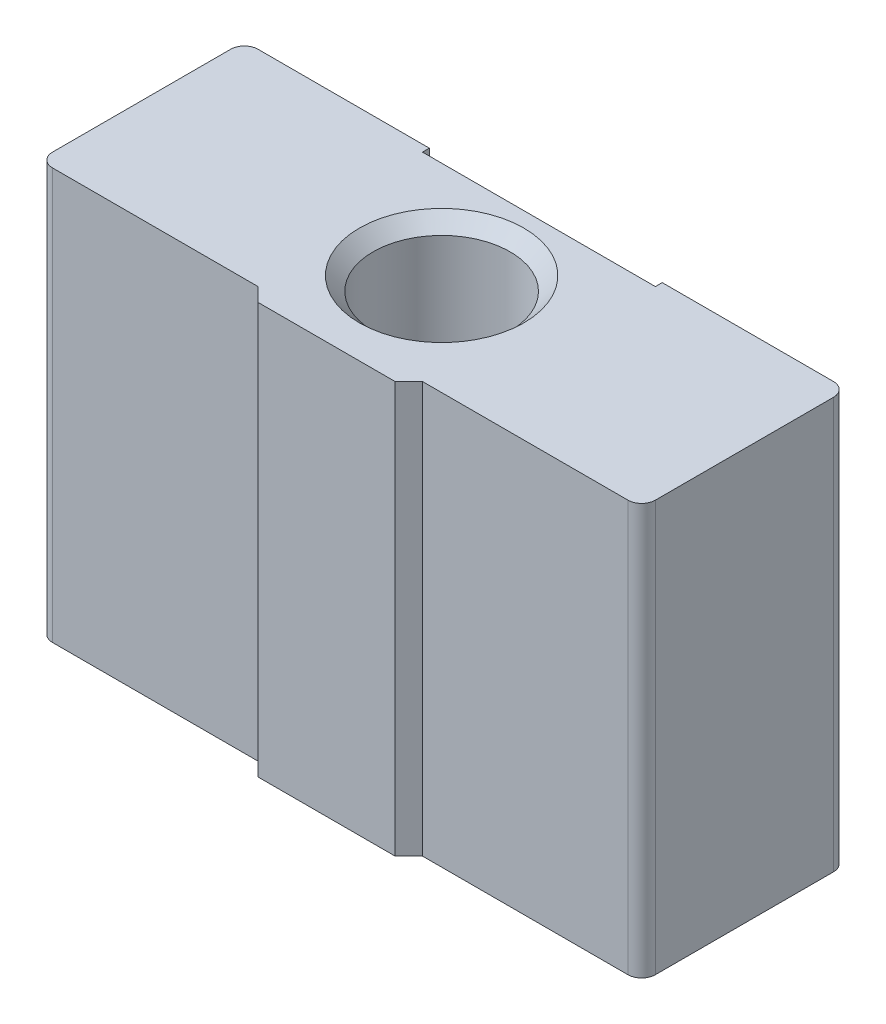
ISO-10303-21;
HEADER;
FILE_DESCRIPTION(('STEP AP214'),'2;1');
FILE_NAME('part.step','',(''),(''),'','','');
FILE_SCHEMA(('AUTOMOTIVE_DESIGN { 1 0 10303 214 1 1 1 1 }'));
ENDSEC;
DATA;
#1=APPLICATION_CONTEXT('core data for automotive mechanical design processes');
#2=APPLICATION_PROTOCOL_DEFINITION('international standard','automotive_design',2000,#1);
#3=PRODUCT_CONTEXT('',#1,'mechanical');
#4=PRODUCT('Part','Part','',(#3));
#5=PRODUCT_RELATED_PRODUCT_CATEGORY('part','',(#4));
#6=PRODUCT_DEFINITION_FORMATION('','',#4);
#7=PRODUCT_DEFINITION_CONTEXT('part definition',#1,'design');
#8=PRODUCT_DEFINITION('design','',#6,#7);
#9=PRODUCT_DEFINITION_SHAPE('','',#8);
#10=(LENGTH_UNIT() NAMED_UNIT(*) SI_UNIT(.MILLI.,.METRE.));
#11=(NAMED_UNIT(*) PLANE_ANGLE_UNIT() SI_UNIT($,.RADIAN.));
#12=(NAMED_UNIT(*) SI_UNIT($,.STERADIAN.) SOLID_ANGLE_UNIT());
#13=UNCERTAINTY_MEASURE_WITH_UNIT(LENGTH_MEASURE(1.E-05),#10,'distance_accuracy_value','');
#14=(GEOMETRIC_REPRESENTATION_CONTEXT(3) GLOBAL_UNCERTAINTY_ASSIGNED_CONTEXT((#13)) GLOBAL_UNIT_ASSIGNED_CONTEXT((#10,
#11,#12)) REPRESENTATION_CONTEXT('',''));
#15=CARTESIAN_POINT('',(0.,0.,0.));
#16=DIRECTION('',(0.,0.,1.));
#17=DIRECTION('',(1.,0.,0.));
#18=AXIS2_PLACEMENT_3D('',#15,#16,#17);
#19=CARTESIAN_POINT('',(-22.,30.,0.));
#20=DIRECTION('',(0.,0.,1.));
#21=DIRECTION('',(1.,0.,0.));
#22=AXIS2_PLACEMENT_3D('',#19,#20,#21);
#23=PLANE('',#22);
#24=CARTESIAN_POINT('',(16.,6.,0.));
#25=DIRECTION('',(0.,0.,-1.));
#26=DIRECTION('',(-1.,0.,0.));
#27=AXIS2_PLACEMENT_3D('',#24,#25,#26);
#28=CIRCLE('',#27,2.25);
#29=CARTESIAN_POINT('',(13.75,6.,0.));
#30=VERTEX_POINT('',#29);
#31=EDGE_CURVE('E219',#30,#30,#28,.T.);
#32=ORIENTED_EDGE('',*,*,#31,.F.);
#33=EDGE_LOOP('',(#32));
#34=FACE_BOUND('',#33,.T.);
#35=CARTESIAN_POINT('',(16.,24.,0.));
#36=DIRECTION('',(0.,0.,-1.));
#37=DIRECTION('',(-1.,0.,0.));
#38=AXIS2_PLACEMENT_3D('',#35,#36,#37);
#39=CIRCLE('',#38,2.25);
#40=CARTESIAN_POINT('',(13.75,24.,0.));
#41=VERTEX_POINT('',#40);
#42=EDGE_CURVE('E197',#41,#41,#39,.T.);
#43=ORIENTED_EDGE('',*,*,#42,.F.);
#44=EDGE_LOOP('',(#43));
#45=FACE_BOUND('',#44,.T.);
#46=DIRECTION('',(-1.,0.,0.));
#47=VECTOR('',#46,1.);
#48=CARTESIAN_POINT('',(-22.,30.,0.));
#49=LINE('',#48,#47);
#50=CARTESIAN_POINT('',(21.,30.,0.));
#51=VERTEX_POINT('',#50);
#52=CARTESIAN_POINT('',(8.5,30.,0.));
#53=VERTEX_POINT('',#52);
#54=EDGE_CURVE('E186',#51,#53,#49,.T.);
#55=ORIENTED_EDGE('',*,*,#54,.F.);
#56=DIRECTION('',(0.,-1.,0.));
#57=VECTOR('',#56,1.);
#58=CARTESIAN_POINT('',(21.,30.,0.));
#59=LINE('',#58,#57);
#60=CARTESIAN_POINT('',(21.,0.,0.));
#61=VERTEX_POINT('',#60);
#62=EDGE_CURVE('E312',#51,#61,#59,.T.);
#63=ORIENTED_EDGE('',*,*,#62,.T.);
#64=DIRECTION('',(-1.,0.,0.));
#65=VECTOR('',#64,1.);
#66=CARTESIAN_POINT('',(-22.,0.,0.));
#67=LINE('',#66,#65);
#68=CARTESIAN_POINT('',(8.5,0.,0.));
#69=VERTEX_POINT('',#68);
#70=EDGE_CURVE('E251',#61,#69,#67,.T.);
#71=ORIENTED_EDGE('',*,*,#70,.T.);
#72=DIRECTION('',(0.,-1.,0.));
#73=VECTOR('',#72,1.);
#74=CARTESIAN_POINT('',(8.5,30.,0.));
#75=LINE('',#74,#73);
#76=EDGE_CURVE('E195',#53,#69,#75,.T.);
#77=ORIENTED_EDGE('',*,*,#76,.F.);
#78=EDGE_LOOP('',(#55,#63,#71,#77));
#79=FACE_BOUND('',#78,.T.);
#80=ADVANCED_FACE('F38',(#34,#45,#79),#23,.F.);
#81=CARTESIAN_POINT('',(-22.,30.,15.));
#82=DIRECTION('',(0.,0.,-1.));
#83=DIRECTION('',(-1.,0.,0.));
#84=AXIS2_PLACEMENT_3D('',#81,#82,#83);
#85=PLANE('',#84);
#86=DIRECTION('',(1.,0.,0.));
#87=VECTOR('',#86,1.);
#88=CARTESIAN_POINT('',(-22.,30.,15.));
#89=LINE('',#88,#87);
#90=CARTESIAN_POINT('',(-21.,30.,15.));
#91=VERTEX_POINT('',#90);
#92=CARTESIAN_POINT('',(-6.00000000000001,30.,15.));
#93=VERTEX_POINT('',#92);
#94=EDGE_CURVE('E226',#91,#93,#89,.T.);
#95=ORIENTED_EDGE('',*,*,#94,.F.);
#96=DIRECTION('',(0.,-1.,0.));
#97=VECTOR('',#96,1.);
#98=CARTESIAN_POINT('',(-21.,30.,15.));
#99=LINE('',#98,#97);
#100=CARTESIAN_POINT('',(-21.,0.,15.));
#101=VERTEX_POINT('',#100);
#102=EDGE_CURVE('E287',#91,#101,#99,.T.);
#103=ORIENTED_EDGE('',*,*,#102,.T.);
#104=DIRECTION('',(1.,0.,0.));
#105=VECTOR('',#104,1.);
#106=CARTESIAN_POINT('',(-22.,0.,15.));
#107=LINE('',#106,#105);
#108=CARTESIAN_POINT('',(-6.00000000000001,0.,15.));
#109=VERTEX_POINT('',#108);
#110=EDGE_CURVE('E225',#101,#109,#107,.T.);
#111=ORIENTED_EDGE('',*,*,#110,.T.);
#112=DIRECTION('',(0.,1.,0.));
#113=VECTOR('',#112,1.);
#114=CARTESIAN_POINT('',(-6.00000000000001,30.,15.));
#115=LINE('',#114,#113);
#116=EDGE_CURVE('E260',#109,#93,#115,.T.);
#117=ORIENTED_EDGE('',*,*,#116,.T.);
#118=EDGE_LOOP('',(#95,#103,#111,#117));
#119=FACE_BOUND('',#118,.T.);
#120=ADVANCED_FACE('F356',(#119),#85,.F.);
#121=CARTESIAN_POINT('',(-5.,30.,16.));
#122=DIRECTION('',(0.,0.,-1.));
#123=DIRECTION('',(-1.,0.,0.));
#124=AXIS2_PLACEMENT_3D('',#121,#122,#123);
#125=PLANE('',#124);
#126=DIRECTION('',(1.,0.,0.));
#127=VECTOR('',#126,1.);
#128=CARTESIAN_POINT('',(-5.,0.,16.));
#129=LINE('',#128,#127);
#130=CARTESIAN_POINT('',(-5.,0.,16.));
#131=VERTEX_POINT('',#130);
#132=CARTESIAN_POINT('',(5.,0.,16.));
#133=VERTEX_POINT('',#132);
#134=EDGE_CURVE('E242',#131,#133,#129,.T.);
#135=ORIENTED_EDGE('',*,*,#134,.T.);
#136=DIRECTION('',(0.,-1.,0.));
#137=VECTOR('',#136,1.);
#138=CARTESIAN_POINT('',(5.,30.,16.));
#139=LINE('',#138,#137);
#140=CARTESIAN_POINT('',(5.,30.,16.));
#141=VERTEX_POINT('',#140);
#142=EDGE_CURVE('E240',#141,#133,#139,.T.);
#143=ORIENTED_EDGE('',*,*,#142,.F.);
#144=DIRECTION('',(1.,0.,0.));
#145=VECTOR('',#144,1.);
#146=CARTESIAN_POINT('',(-5.,30.,16.));
#147=LINE('',#146,#145);
#148=CARTESIAN_POINT('',(-5.,30.,16.));
#149=VERTEX_POINT('',#148);
#150=EDGE_CURVE('E228',#149,#141,#147,.T.);
#151=ORIENTED_EDGE('',*,*,#150,.F.);
#152=DIRECTION('',(0.,-1.,0.));
#153=VECTOR('',#152,1.);
#154=CARTESIAN_POINT('',(-5.,30.,16.));
#155=LINE('',#154,#153);
#156=EDGE_CURVE('E257',#149,#131,#155,.T.);
#157=ORIENTED_EDGE('',*,*,#156,.T.);
#158=EDGE_LOOP('',(#135,#143,#151,#157));
#159=FACE_BOUND('',#158,.T.);
#160=ADVANCED_FACE('F364',(#159),#125,.F.);
#161=CARTESIAN_POINT('',(5.,30.,15.));
#162=DIRECTION('',(0.,0.,-1.));
#163=DIRECTION('',(-1.,0.,0.));
#164=AXIS2_PLACEMENT_3D('',#161,#162,#163);
#165=PLANE('',#164);
#166=DIRECTION('',(1.,0.,0.));
#167=VECTOR('',#166,1.);
#168=CARTESIAN_POINT('',(5.,0.,15.));
#169=LINE('',#168,#167);
#170=CARTESIAN_POINT('',(5.99999999999999,0.,15.));
#171=VERTEX_POINT('',#170);
#172=CARTESIAN_POINT('',(21.,0.,15.));
#173=VERTEX_POINT('',#172);
#174=EDGE_CURVE('E245',#171,#173,#169,.T.);
#175=ORIENTED_EDGE('',*,*,#174,.T.);
#176=DIRECTION('',(0.,-1.,0.));
#177=VECTOR('',#176,1.);
#178=CARTESIAN_POINT('',(21.,30.,15.));
#179=LINE('',#178,#177);
#180=CARTESIAN_POINT('',(21.,30.,15.));
#181=VERTEX_POINT('',#180);
#182=EDGE_CURVE('E11',#173,#181,#179,.F.);
#183=ORIENTED_EDGE('',*,*,#182,.T.);
#184=DIRECTION('',(1.,0.,0.));
#185=VECTOR('',#184,1.);
#186=CARTESIAN_POINT('',(5.,30.,15.));
#187=LINE('',#186,#185);
#188=CARTESIAN_POINT('',(5.99999999999999,30.,15.));
#189=VERTEX_POINT('',#188);
#190=EDGE_CURVE('E231',#189,#181,#187,.T.);
#191=ORIENTED_EDGE('',*,*,#190,.F.);
#192=DIRECTION('',(0.,-1.,0.));
#193=VECTOR('',#192,1.);
#194=CARTESIAN_POINT('',(5.99999999999999,0.,15.));
#195=LINE('',#194,#193);
#196=EDGE_CURVE('E263',#189,#171,#195,.T.);
#197=ORIENTED_EDGE('',*,*,#196,.T.);
#198=EDGE_LOOP('',(#175,#183,#191,#197));
#199=FACE_BOUND('',#198,.T.);
#200=ADVANCED_FACE('F373',(#199),#165,.F.);
#201=CARTESIAN_POINT('',(22.,30.,15.));
#202=DIRECTION('',(-1.,0.,0.));
#203=DIRECTION('',(0.,0.,1.));
#204=AXIS2_PLACEMENT_3D('',#201,#202,#203);
#205=PLANE('',#204);
#206=DIRECTION('',(0.,0.,-1.));
#207=VECTOR('',#206,1.);
#208=CARTESIAN_POINT('',(22.,0.,15.));
#209=LINE('',#208,#207);
#210=CARTESIAN_POINT('',(22.,0.,14.));
#211=VERTEX_POINT('',#210);
#212=CARTESIAN_POINT('',(22.,0.,0.999999999999999));
#213=VERTEX_POINT('',#212);
#214=EDGE_CURVE('E248',#211,#213,#209,.T.);
#215=ORIENTED_EDGE('',*,*,#214,.T.);
#216=DIRECTION('',(0.,-1.,0.));
#217=VECTOR('',#216,1.);
#218=CARTESIAN_POINT('',(22.,30.,0.999999999999999));
#219=LINE('',#218,#217);
#220=CARTESIAN_POINT('',(22.,30.,0.999999999999999));
#221=VERTEX_POINT('',#220);
#222=EDGE_CURVE('E46',#213,#221,#219,.F.);
#223=ORIENTED_EDGE('',*,*,#222,.T.);
#224=DIRECTION('',(0.,0.,-1.));
#225=VECTOR('',#224,1.);
#226=CARTESIAN_POINT('',(22.,30.,15.));
#227=LINE('',#226,#225);
#228=CARTESIAN_POINT('',(22.,30.,14.));
#229=VERTEX_POINT('',#228);
#230=EDGE_CURVE('E234',#229,#221,#227,.T.);
#231=ORIENTED_EDGE('',*,*,#230,.F.);
#232=DIRECTION('',(0.,-1.,0.));
#233=VECTOR('',#232,1.);
#234=CARTESIAN_POINT('',(22.,30.,14.));
#235=LINE('',#234,#233);
#236=EDGE_CURVE('E315',#229,#211,#235,.T.);
#237=ORIENTED_EDGE('',*,*,#236,.T.);
#238=EDGE_LOOP('',(#215,#223,#231,#237));
#239=FACE_BOUND('',#238,.T.);
#240=ADVANCED_FACE('F319',(#239),#205,.F.);
#241=CARTESIAN_POINT('',(-16.,24.,0.));
#242=DIRECTION('',(0.,0.,-1.));
#243=DIRECTION('',(-1.,0.,0.));
#244=AXIS2_PLACEMENT_3D('',#241,#242,#243);
#245=CIRCLE('',#244,2.25);
#246=CARTESIAN_POINT('',(-18.25,24.,0.));
#247=VERTEX_POINT('',#246);
#248=EDGE_CURVE('E207',#247,#247,#245,.T.);
#249=ORIENTED_EDGE('',*,*,#248,.F.);
#250=EDGE_LOOP('',(#249));
#251=FACE_BOUND('',#250,.T.);
#252=CARTESIAN_POINT('',(-16.,6.,0.));
#253=DIRECTION('',(0.,0.,-1.));
#254=DIRECTION('',(-1.,0.,0.));
#255=AXIS2_PLACEMENT_3D('',#252,#253,#254);
#256=CIRCLE('',#255,2.25);
#257=CARTESIAN_POINT('',(-18.25,6.,0.));
#258=VERTEX_POINT('',#257);
#259=EDGE_CURVE('E213',#258,#258,#256,.T.);
#260=ORIENTED_EDGE('',*,*,#259,.F.);
#261=EDGE_LOOP('',(#260));
#262=FACE_BOUND('',#261,.T.);
#263=CARTESIAN_POINT('',(-8.5,0.,0.));
#264=VERTEX_POINT('',#263);
#265=CARTESIAN_POINT('',(-21.,0.,0.));
#266=VERTEX_POINT('',#265);
#267=EDGE_CURVE('E250',#264,#266,#67,.T.);
#268=ORIENTED_EDGE('',*,*,#267,.T.);
#269=DIRECTION('',(0.,-1.,0.));
#270=VECTOR('',#269,1.);
#271=CARTESIAN_POINT('',(-21.,30.,0.));
#272=LINE('',#271,#270);
#273=CARTESIAN_POINT('',(-21.,30.,0.));
#274=VERTEX_POINT('',#273);
#275=EDGE_CURVE('E310',#266,#274,#272,.F.);
#276=ORIENTED_EDGE('',*,*,#275,.T.);
#277=CARTESIAN_POINT('',(-8.5,30.,0.));
#278=VERTEX_POINT('',#277);
#279=EDGE_CURVE('E236',#278,#274,#49,.T.);
#280=ORIENTED_EDGE('',*,*,#279,.F.);
#281=DIRECTION('',(0.,-1.,0.));
#282=VECTOR('',#281,1.);
#283=CARTESIAN_POINT('',(-8.5,30.,0.));
#284=LINE('',#283,#282);
#285=EDGE_CURVE('E198',#278,#264,#284,.T.);
#286=ORIENTED_EDGE('',*,*,#285,.T.);
#287=EDGE_LOOP('',(#268,#276,#280,#286));
#288=FACE_BOUND('',#287,.T.);
#289=ADVANCED_FACE('F338',(#251,#262,#288),#23,.F.);
#290=CARTESIAN_POINT('',(-22.,30.,0.));
#291=DIRECTION('',(1.,0.,0.));
#292=DIRECTION('',(0.,0.,-1.));
#293=AXIS2_PLACEMENT_3D('',#290,#291,#292);
#294=PLANE('',#293);
#295=DIRECTION('',(0.,0.,1.));
#296=VECTOR('',#295,1.);
#297=CARTESIAN_POINT('',(-22.,0.,0.));
#298=LINE('',#297,#296);
#299=CARTESIAN_POINT('',(-22.,0.,1.));
#300=VERTEX_POINT('',#299);
#301=CARTESIAN_POINT('',(-22.,0.,14.));
#302=VERTEX_POINT('',#301);
#303=EDGE_CURVE('E229',#300,#302,#298,.T.);
#304=ORIENTED_EDGE('',*,*,#303,.T.);
#305=DIRECTION('',(0.,-1.,0.));
#306=VECTOR('',#305,1.);
#307=CARTESIAN_POINT('',(-22.,30.,14.));
#308=LINE('',#307,#306);
#309=CARTESIAN_POINT('',(-22.,30.,14.));
#310=VERTEX_POINT('',#309);
#311=EDGE_CURVE('E301',#302,#310,#308,.F.);
#312=ORIENTED_EDGE('',*,*,#311,.T.);
#313=DIRECTION('',(0.,0.,1.));
#314=VECTOR('',#313,1.);
#315=CARTESIAN_POINT('',(-22.,30.,0.));
#316=LINE('',#315,#314);
#317=CARTESIAN_POINT('',(-22.,30.,1.));
#318=VERTEX_POINT('',#317);
#319=EDGE_CURVE('E238',#318,#310,#316,.T.);
#320=ORIENTED_EDGE('',*,*,#319,.F.);
#321=DIRECTION('',(0.,-1.,0.));
#322=VECTOR('',#321,1.);
#323=CARTESIAN_POINT('',(-22.,30.,1.));
#324=LINE('',#323,#322);
#325=EDGE_CURVE('E298',#318,#300,#324,.T.);
#326=ORIENTED_EDGE('',*,*,#325,.T.);
#327=EDGE_LOOP('',(#304,#312,#320,#326));
#328=FACE_BOUND('',#327,.T.);
#329=ADVANCED_FACE('F348',(#328),#294,.F.);
#330=CARTESIAN_POINT('',(0.,30.,0.));
#331=DIRECTION('',(0.,1.,0.));
#332=DIRECTION('',(0.,0.,1.));
#333=AXIS2_PLACEMENT_3D('',#330,#331,#332);
#334=PLANE('',#333);
#335=CARTESIAN_POINT('',(0.,30.,7.6));
#336=DIRECTION('',(0.,1.,0.));
#337=DIRECTION('',(0.,0.,1.));
#338=AXIS2_PLACEMENT_3D('',#335,#336,#337);
#339=CIRCLE('',#338,6.);
#340=CARTESIAN_POINT('',(0.,30.,13.6));
#341=VERTEX_POINT('',#340);
#342=EDGE_CURVE('E266',#341,#341,#339,.F.);
#343=ORIENTED_EDGE('',*,*,#342,.T.);
#344=EDGE_LOOP('',(#343));
#345=FACE_BOUND('',#344,.T.);
#346=ORIENTED_EDGE('',*,*,#319,.T.);
#347=CARTESIAN_POINT('',(-21.,30.,14.));
#348=DIRECTION('',(0.,1.,0.));
#349=DIRECTION('',(0.,0.,1.));
#350=AXIS2_PLACEMENT_3D('',#347,#348,#349);
#351=CIRCLE('',#350,1.);
#352=EDGE_CURVE('E308',#310,#91,#351,.T.);
#353=ORIENTED_EDGE('',*,*,#352,.T.);
#354=ORIENTED_EDGE('',*,*,#94,.T.);
#355=DIRECTION('',(-0.707106781186549,0.,-0.707106781186546));
#356=VECTOR('',#355,1.);
#357=CARTESIAN_POINT('',(-5.,30.,16.));
#358=LINE('',#357,#356);
#359=EDGE_CURVE('E281',#93,#149,#358,.F.);
#360=ORIENTED_EDGE('',*,*,#359,.T.);
#361=ORIENTED_EDGE('',*,*,#150,.T.);
#362=DIRECTION('',(-0.707106781186541,0.,0.707106781186554));
#363=VECTOR('',#362,1.);
#364=CARTESIAN_POINT('',(5.99999999999999,30.,15.));
#365=LINE('',#364,#363);
#366=EDGE_CURVE('E285',#141,#189,#365,.F.);
#367=ORIENTED_EDGE('',*,*,#366,.T.);
#368=ORIENTED_EDGE('',*,*,#190,.T.);
#369=CARTESIAN_POINT('',(21.,30.,14.));
#370=DIRECTION('',(0.,1.,0.));
#371=DIRECTION('',(0.,0.,1.));
#372=AXIS2_PLACEMENT_3D('',#369,#370,#371);
#373=CIRCLE('',#372,1.);
#374=EDGE_CURVE('E303',#181,#229,#373,.T.);
#375=ORIENTED_EDGE('',*,*,#374,.T.);
#376=ORIENTED_EDGE('',*,*,#230,.T.);
#377=CARTESIAN_POINT('',(21.,30.,1.));
#378=DIRECTION('',(0.,1.,0.));
#379=DIRECTION('',(0.,0.,1.));
#380=AXIS2_PLACEMENT_3D('',#377,#378,#379);
#381=CIRCLE('',#380,1.);
#382=EDGE_CURVE('E53',#221,#51,#381,.T.);
#383=ORIENTED_EDGE('',*,*,#382,.T.);
#384=ORIENTED_EDGE('',*,*,#54,.T.);
#385=DIRECTION('',(0.,0.,1.));
#386=VECTOR('',#385,1.);
#387=CARTESIAN_POINT('',(8.5,30.,0.500000000000003));
#388=LINE('',#387,#386);
#389=CARTESIAN_POINT('',(8.5,30.,0.500000000000003));
#390=VERTEX_POINT('',#389);
#391=EDGE_CURVE('E168',#53,#390,#388,.T.);
#392=ORIENTED_EDGE('',*,*,#391,.T.);
#393=DIRECTION('',(-1.,0.,0.));
#394=VECTOR('',#393,1.);
#395=CARTESIAN_POINT('',(-8.5,30.,0.5));
#396=LINE('',#395,#394);
#397=CARTESIAN_POINT('',(-8.5,30.,0.5));
#398=VERTEX_POINT('',#397);
#399=EDGE_CURVE('E179',#390,#398,#396,.T.);
#400=ORIENTED_EDGE('',*,*,#399,.T.);
#401=DIRECTION('',(0.,0.,-1.));
#402=VECTOR('',#401,1.);
#403=CARTESIAN_POINT('',(-8.5,30.,0.));
#404=LINE('',#403,#402);
#405=EDGE_CURVE('E176',#398,#278,#404,.T.);
#406=ORIENTED_EDGE('',*,*,#405,.T.);
#407=ORIENTED_EDGE('',*,*,#279,.T.);
#408=CARTESIAN_POINT('',(-21.,30.,1.));
#409=DIRECTION('',(0.,1.,0.));
#410=DIRECTION('',(0.,0.,1.));
#411=AXIS2_PLACEMENT_3D('',#408,#409,#410);
#412=CIRCLE('',#411,1.);
#413=EDGE_CURVE('E306',#274,#318,#412,.T.);
#414=ORIENTED_EDGE('',*,*,#413,.T.);
#415=EDGE_LOOP('',(#346,#353,#354,#360,#361,#367,#368,#375,#376,#383,#384,#392,#400,#406,#407,#414));
#416=FACE_BOUND('',#415,.T.);
#417=ADVANCED_FACE('F185',(#345,#416),#334,.T.);
#418=CARTESIAN_POINT('',(0.,0.,0.));
#419=DIRECTION('',(0.,1.,0.));
#420=DIRECTION('',(0.,0.,1.));
#421=AXIS2_PLACEMENT_3D('',#418,#419,#420);
#422=PLANE('',#421);
#423=CARTESIAN_POINT('',(0.,0.,7.6));
#424=DIRECTION('',(0.,1.,0.));
#425=DIRECTION('',(0.,0.,1.));
#426=AXIS2_PLACEMENT_3D('',#423,#424,#425);
#427=CIRCLE('',#426,6.00000000000003);
#428=CARTESIAN_POINT('',(0.,0.,13.6));
#429=VERTEX_POINT('',#428);
#430=EDGE_CURVE('E275',#429,#429,#427,.T.);
#431=ORIENTED_EDGE('',*,*,#430,.T.);
#432=EDGE_LOOP('',(#431));
#433=FACE_BOUND('',#432,.T.);
#434=ORIENTED_EDGE('',*,*,#110,.F.);
#435=CARTESIAN_POINT('',(-21.,0.,14.));
#436=DIRECTION('',(0.,1.,0.));
#437=DIRECTION('',(0.,0.,1.));
#438=AXIS2_PLACEMENT_3D('',#435,#436,#437);
#439=CIRCLE('',#438,1.);
#440=EDGE_CURVE('E296',#101,#302,#439,.F.);
#441=ORIENTED_EDGE('',*,*,#440,.T.);
#442=ORIENTED_EDGE('',*,*,#303,.F.);
#443=CARTESIAN_POINT('',(-21.,0.,1.));
#444=DIRECTION('',(0.,1.,0.));
#445=DIRECTION('',(0.,0.,1.));
#446=AXIS2_PLACEMENT_3D('',#443,#444,#445);
#447=CIRCLE('',#446,1.);
#448=EDGE_CURVE('E294',#300,#266,#447,.F.);
#449=ORIENTED_EDGE('',*,*,#448,.T.);
#450=ORIENTED_EDGE('',*,*,#267,.F.);
#451=DIRECTION('',(0.,0.,-1.));
#452=VECTOR('',#451,1.);
#453=CARTESIAN_POINT('',(-8.5,0.,0.));
#454=LINE('',#453,#452);
#455=CARTESIAN_POINT('',(-8.5,0.,0.5));
#456=VERTEX_POINT('',#455);
#457=EDGE_CURVE('E187',#456,#264,#454,.T.);
#458=ORIENTED_EDGE('',*,*,#457,.F.);
#459=DIRECTION('',(-1.,0.,0.));
#460=VECTOR('',#459,1.);
#461=CARTESIAN_POINT('',(-8.5,0.,0.5));
#462=LINE('',#461,#460);
#463=CARTESIAN_POINT('',(8.5,0.,0.500000000000003));
#464=VERTEX_POINT('',#463);
#465=EDGE_CURVE('E189',#464,#456,#462,.T.);
#466=ORIENTED_EDGE('',*,*,#465,.F.);
#467=DIRECTION('',(0.,0.,1.));
#468=VECTOR('',#467,1.);
#469=CARTESIAN_POINT('',(8.5,0.,0.500000000000003));
#470=LINE('',#469,#468);
#471=EDGE_CURVE('E171',#69,#464,#470,.T.);
#472=ORIENTED_EDGE('',*,*,#471,.F.);
#473=ORIENTED_EDGE('',*,*,#70,.F.);
#474=CARTESIAN_POINT('',(21.,0.,1.));
#475=DIRECTION('',(0.,1.,0.));
#476=DIRECTION('',(0.,0.,1.));
#477=AXIS2_PLACEMENT_3D('',#474,#475,#476);
#478=CIRCLE('',#477,1.);
#479=EDGE_CURVE('E292',#61,#213,#478,.F.);
#480=ORIENTED_EDGE('',*,*,#479,.T.);
#481=ORIENTED_EDGE('',*,*,#214,.F.);
#482=CARTESIAN_POINT('',(21.,0.,14.));
#483=DIRECTION('',(0.,1.,0.));
#484=DIRECTION('',(0.,0.,1.));
#485=AXIS2_PLACEMENT_3D('',#482,#483,#484);
#486=CIRCLE('',#485,1.);
#487=EDGE_CURVE('E290',#211,#173,#486,.F.);
#488=ORIENTED_EDGE('',*,*,#487,.T.);
#489=ORIENTED_EDGE('',*,*,#174,.F.);
#490=DIRECTION('',(0.707106781186541,0.,-0.707106781186554));
#491=VECTOR('',#490,1.);
#492=CARTESIAN_POINT('',(10.5,0.,10.4999999999999));
#493=LINE('',#492,#491);
#494=EDGE_CURVE('E283',#171,#133,#493,.F.);
#495=ORIENTED_EDGE('',*,*,#494,.T.);
#496=ORIENTED_EDGE('',*,*,#134,.F.);
#497=DIRECTION('',(0.707106781186549,0.,0.707106781186546));
#498=VECTOR('',#497,1.);
#499=CARTESIAN_POINT('',(-10.5,0.,10.5));
#500=LINE('',#499,#498);
#501=EDGE_CURVE('E278',#131,#109,#500,.F.);
#502=ORIENTED_EDGE('',*,*,#501,.T.);
#503=EDGE_LOOP('',(#434,#441,#442,#449,#450,#458,#466,#472,#473,#480,#481,#488,#489,#495,#496,#502));
#504=FACE_BOUND('',#503,.T.);
#505=ADVANCED_FACE('F324',(#433,#504),#422,.F.);
#506=CARTESIAN_POINT('',(0.,30.,7.6));
#507=DIRECTION('',(0.,-1.,0.));
#508=DIRECTION('',(0.,0.,-1.));
#509=AXIS2_PLACEMENT_3D('',#506,#507,#508);
#510=CYLINDRICAL_SURFACE('',#509,5.);
#511=CARTESIAN_POINT('',(0.,29.,7.6));
#512=DIRECTION('',(0.,1.,0.));
#513=DIRECTION('',(0.,0.,1.));
#514=AXIS2_PLACEMENT_3D('',#511,#512,#513);
#515=CIRCLE('',#514,5.);
#516=CARTESIAN_POINT('',(0.,29.,12.6));
#517=VERTEX_POINT('',#516);
#518=EDGE_CURVE('E272',#517,#517,#515,.T.);
#519=ORIENTED_EDGE('',*,*,#518,.T.);
#520=EDGE_LOOP('',(#519));
#521=FACE_BOUND('',#520,.T.);
#522=CARTESIAN_POINT('',(0.,1.00000000000002,7.6));
#523=DIRECTION('',(0.,1.,0.));
#524=DIRECTION('',(0.,0.,1.));
#525=AXIS2_PLACEMENT_3D('',#522,#523,#524);
#526=CIRCLE('',#525,5.);
#527=CARTESIAN_POINT('',(0.,1.00000000000002,12.6));
#528=VERTEX_POINT('',#527);
#529=EDGE_CURVE('E269',#528,#528,#526,.F.);
#530=ORIENTED_EDGE('',*,*,#529,.T.);
#531=EDGE_LOOP('',(#530));
#532=FACE_BOUND('',#531,.T.);
#533=ADVANCED_FACE('F425',(#521,#532),#510,.F.);
#534=CARTESIAN_POINT('',(16.,6.,10.));
#535=DIRECTION('',(0.,0.,-1.));
#536=DIRECTION('',(-1.,0.,0.));
#537=AXIS2_PLACEMENT_3D('',#534,#535,#536);
#538=CONICAL_SURFACE('',#537,2.25,1.02974425867665);
#539=CARTESIAN_POINT('',(16.,6.,11.351936392812));
#540=VERTEX_POINT('',#539);
#541=VERTEX_LOOP('',#540);
#542=FACE_BOUND('',#541,.T.);
#543=CARTESIAN_POINT('',(16.,6.,10.));
#544=DIRECTION('',(0.,0.,-1.));
#545=DIRECTION('',(-1.,0.,0.));
#546=AXIS2_PLACEMENT_3D('',#543,#544,#545);
#547=CIRCLE('',#546,2.25);
#548=CARTESIAN_POINT('',(13.75,6.,10.));
#549=VERTEX_POINT('',#548);
#550=EDGE_CURVE('E222',#549,#549,#547,.T.);
#551=ORIENTED_EDGE('',*,*,#550,.T.);
#552=EDGE_LOOP('',(#551));
#553=FACE_BOUND('',#552,.T.);
#554=ADVANCED_FACE('F421',(#542,#553),#538,.F.);
#555=CARTESIAN_POINT('',(16.,6.,0.));
#556=DIRECTION('',(0.,0.,-1.));
#557=DIRECTION('',(-1.,0.,0.));
#558=AXIS2_PLACEMENT_3D('',#555,#556,#557);
#559=CYLINDRICAL_SURFACE('',#558,2.25);
#560=ORIENTED_EDGE('',*,*,#550,.F.);
#561=EDGE_LOOP('',(#560));
#562=FACE_BOUND('',#561,.T.);
#563=ORIENTED_EDGE('',*,*,#31,.T.);
#564=EDGE_LOOP('',(#563));
#565=FACE_BOUND('',#564,.T.);
#566=ADVANCED_FACE('F413',(#562,#565),#559,.F.);
#567=CARTESIAN_POINT('',(-16.,6.,10.));
#568=DIRECTION('',(0.,0.,-1.));
#569=DIRECTION('',(-1.,0.,0.));
#570=AXIS2_PLACEMENT_3D('',#567,#568,#569);
#571=CONICAL_SURFACE('',#570,2.25,1.02974425867665);
#572=CARTESIAN_POINT('',(-16.,6.,11.351936392812));
#573=VERTEX_POINT('',#572);
#574=VERTEX_LOOP('',#573);
#575=FACE_BOUND('',#574,.T.);
#576=CARTESIAN_POINT('',(-16.,6.,10.));
#577=DIRECTION('',(0.,0.,-1.));
#578=DIRECTION('',(-1.,0.,0.));
#579=AXIS2_PLACEMENT_3D('',#576,#577,#578);
#580=CIRCLE('',#579,2.25);
#581=CARTESIAN_POINT('',(-18.25,6.,10.));
#582=VERTEX_POINT('',#581);
#583=EDGE_CURVE('E216',#582,#582,#580,.T.);
#584=ORIENTED_EDGE('',*,*,#583,.T.);
#585=EDGE_LOOP('',(#584));
#586=FACE_BOUND('',#585,.T.);
#587=ADVANCED_FACE('F403',(#575,#586),#571,.F.);
#588=CARTESIAN_POINT('',(-16.,6.,0.));
#589=DIRECTION('',(0.,0.,-1.));
#590=DIRECTION('',(-1.,0.,0.));
#591=AXIS2_PLACEMENT_3D('',#588,#589,#590);
#592=CYLINDRICAL_SURFACE('',#591,2.25);
#593=ORIENTED_EDGE('',*,*,#583,.F.);
#594=EDGE_LOOP('',(#593));
#595=FACE_BOUND('',#594,.T.);
#596=ORIENTED_EDGE('',*,*,#259,.T.);
#597=EDGE_LOOP('',(#596));
#598=FACE_BOUND('',#597,.T.);
#599=ADVANCED_FACE('F400',(#595,#598),#592,.F.);
#600=CARTESIAN_POINT('',(-16.,24.,10.));
#601=DIRECTION('',(0.,0.,-1.));
#602=DIRECTION('',(-1.,0.,0.));
#603=AXIS2_PLACEMENT_3D('',#600,#601,#602);
#604=CONICAL_SURFACE('',#603,2.25,1.02974425867665);
#605=CARTESIAN_POINT('',(-16.,24.,11.351936392812));
#606=VERTEX_POINT('',#605);
#607=VERTEX_LOOP('',#606);
#608=FACE_BOUND('',#607,.T.);
#609=CARTESIAN_POINT('',(-16.,24.,10.));
#610=DIRECTION('',(0.,0.,-1.));
#611=DIRECTION('',(-1.,0.,0.));
#612=AXIS2_PLACEMENT_3D('',#609,#610,#611);
#613=CIRCLE('',#612,2.25);
#614=CARTESIAN_POINT('',(-18.25,24.,10.));
#615=VERTEX_POINT('',#614);
#616=EDGE_CURVE('E210',#615,#615,#613,.T.);
#617=ORIENTED_EDGE('',*,*,#616,.T.);
#618=EDGE_LOOP('',(#617));
#619=FACE_BOUND('',#618,.T.);
#620=ADVANCED_FACE('F402',(#608,#619),#604,.F.);
#621=CARTESIAN_POINT('',(-16.,24.,0.));
#622=DIRECTION('',(0.,0.,-1.));
#623=DIRECTION('',(-1.,0.,0.));
#624=AXIS2_PLACEMENT_3D('',#621,#622,#623);
#625=CYLINDRICAL_SURFACE('',#624,2.25);
#626=ORIENTED_EDGE('',*,*,#616,.F.);
#627=EDGE_LOOP('',(#626));
#628=FACE_BOUND('',#627,.T.);
#629=ORIENTED_EDGE('',*,*,#248,.T.);
#630=EDGE_LOOP('',(#629));
#631=FACE_BOUND('',#630,.T.);
#632=ADVANCED_FACE('F410',(#628,#631),#625,.F.);
#633=CARTESIAN_POINT('',(16.,24.,10.));
#634=DIRECTION('',(0.,0.,-1.));
#635=DIRECTION('',(-1.,0.,0.));
#636=AXIS2_PLACEMENT_3D('',#633,#634,#635);
#637=CONICAL_SURFACE('',#636,2.25,1.02974425867665);
#638=CARTESIAN_POINT('',(16.,24.,11.351936392812));
#639=VERTEX_POINT('',#638);
#640=VERTEX_LOOP('',#639);
#641=FACE_BOUND('',#640,.T.);
#642=CARTESIAN_POINT('',(16.,24.,10.));
#643=DIRECTION('',(0.,0.,-1.));
#644=DIRECTION('',(-1.,0.,0.));
#645=AXIS2_PLACEMENT_3D('',#642,#643,#644);
#646=CIRCLE('',#645,2.25);
#647=CARTESIAN_POINT('',(13.75,24.,10.));
#648=VERTEX_POINT('',#647);
#649=EDGE_CURVE('E204',#648,#648,#646,.T.);
#650=ORIENTED_EDGE('',*,*,#649,.T.);
#651=EDGE_LOOP('',(#650));
#652=FACE_BOUND('',#651,.T.);
#653=ADVANCED_FACE('F539',(#641,#652),#637,.F.);
#654=CARTESIAN_POINT('',(16.,24.,0.));
#655=DIRECTION('',(0.,0.,-1.));
#656=DIRECTION('',(-1.,0.,0.));
#657=AXIS2_PLACEMENT_3D('',#654,#655,#656);
#658=CYLINDRICAL_SURFACE('',#657,2.25);
#659=ORIENTED_EDGE('',*,*,#649,.F.);
#660=EDGE_LOOP('',(#659));
#661=FACE_BOUND('',#660,.T.);
#662=ORIENTED_EDGE('',*,*,#42,.T.);
#663=EDGE_LOOP('',(#662));
#664=FACE_BOUND('',#663,.T.);
#665=ADVANCED_FACE('F526',(#661,#664),#658,.F.);
#666=CARTESIAN_POINT('',(8.5,30.,0.500000000000003));
#667=DIRECTION('',(1.,0.,0.));
#668=DIRECTION('',(0.,0.,-1.));
#669=AXIS2_PLACEMENT_3D('',#666,#667,#668);
#670=PLANE('',#669);
#671=ORIENTED_EDGE('',*,*,#471,.T.);
#672=DIRECTION('',(0.,-1.,0.));
#673=VECTOR('',#672,1.);
#674=CARTESIAN_POINT('',(8.5,30.,0.500000000000003));
#675=LINE('',#674,#673);
#676=EDGE_CURVE('E163',#390,#464,#675,.T.);
#677=ORIENTED_EDGE('',*,*,#676,.F.);
#678=ORIENTED_EDGE('',*,*,#391,.F.);
#679=ORIENTED_EDGE('',*,*,#76,.T.);
#680=EDGE_LOOP('',(#671,#677,#678,#679));
#681=FACE_BOUND('',#680,.T.);
#682=ADVANCED_FACE('F165',(#681),#670,.F.);
#683=CARTESIAN_POINT('',(-8.5,30.,0.));
#684=DIRECTION('',(-1.,0.,0.));
#685=DIRECTION('',(0.,0.,1.));
#686=AXIS2_PLACEMENT_3D('',#683,#684,#685);
#687=PLANE('',#686);
#688=ORIENTED_EDGE('',*,*,#457,.T.);
#689=ORIENTED_EDGE('',*,*,#285,.F.);
#690=ORIENTED_EDGE('',*,*,#405,.F.);
#691=DIRECTION('',(0.,-1.,0.));
#692=VECTOR('',#691,1.);
#693=CARTESIAN_POINT('',(-8.5,30.,0.5));
#694=LINE('',#693,#692);
#695=EDGE_CURVE('E175',#398,#456,#694,.T.);
#696=ORIENTED_EDGE('',*,*,#695,.T.);
#697=EDGE_LOOP('',(#688,#689,#690,#696));
#698=FACE_BOUND('',#697,.T.);
#699=ADVANCED_FACE('F335',(#698),#687,.F.);
#700=CARTESIAN_POINT('',(-8.5,30.,0.5));
#701=DIRECTION('',(0.,0.,1.));
#702=DIRECTION('',(1.,0.,0.));
#703=AXIS2_PLACEMENT_3D('',#700,#701,#702);
#704=PLANE('',#703);
#705=ORIENTED_EDGE('',*,*,#465,.T.);
#706=ORIENTED_EDGE('',*,*,#695,.F.);
#707=ORIENTED_EDGE('',*,*,#399,.F.);
#708=ORIENTED_EDGE('',*,*,#676,.T.);
#709=EDGE_LOOP('',(#705,#706,#707,#708));
#710=FACE_BOUND('',#709,.T.);
#711=ADVANCED_FACE('F180',(#710),#704,.F.);
#712=CARTESIAN_POINT('',(-5.,30.,16.));
#713=DIRECTION('',(-0.707106781186546,0.,0.707106781186549));
#714=DIRECTION('',(0.,1.,0.));
#715=AXIS2_PLACEMENT_3D('',#712,#713,#714);
#716=PLANE('',#715);
#717=ORIENTED_EDGE('',*,*,#359,.F.);
#718=ORIENTED_EDGE('',*,*,#116,.F.);
#719=ORIENTED_EDGE('',*,*,#501,.F.);
#720=ORIENTED_EDGE('',*,*,#156,.F.);
#721=EDGE_LOOP('',(#717,#718,#719,#720));
#722=FACE_BOUND('',#721,.T.);
#723=ADVANCED_FACE('F367',(#722),#716,.T.);
#724=CARTESIAN_POINT('',(5.99999999999999,30.,15.));
#725=DIRECTION('',(0.707106781186554,0.,0.707106781186541));
#726=DIRECTION('',(0.,1.,0.));
#727=AXIS2_PLACEMENT_3D('',#724,#725,#726);
#728=PLANE('',#727);
#729=ORIENTED_EDGE('',*,*,#366,.F.);
#730=ORIENTED_EDGE('',*,*,#142,.T.);
#731=ORIENTED_EDGE('',*,*,#494,.F.);
#732=ORIENTED_EDGE('',*,*,#196,.F.);
#733=EDGE_LOOP('',(#729,#730,#731,#732));
#734=FACE_BOUND('',#733,.T.);
#735=ADVANCED_FACE('F369',(#734),#728,.T.);
#736=CARTESIAN_POINT('',(0.,30.,7.6));
#737=DIRECTION('',(0.,1.,0.));
#738=DIRECTION('',(0.,0.,1.));
#739=AXIS2_PLACEMENT_3D('',#736,#737,#738);
#740=CONICAL_SURFACE('',#739,6.,0.785398163397446);
#741=ORIENTED_EDGE('',*,*,#518,.F.);
#742=EDGE_LOOP('',(#741));
#743=FACE_BOUND('',#742,.T.);
#744=ORIENTED_EDGE('',*,*,#342,.F.);
#745=EDGE_LOOP('',(#744));
#746=FACE_BOUND('',#745,.T.);
#747=ADVANCED_FACE('F442',(#743,#746),#740,.F.);
#748=CARTESIAN_POINT('',(0.,1.00000000000002,7.6));
#749=DIRECTION('',(0.,-1.,0.));
#750=DIRECTION('',(0.,0.,-1.));
#751=AXIS2_PLACEMENT_3D('',#748,#749,#750);
#752=CONICAL_SURFACE('',#751,5.,0.785398163397453);
#753=ORIENTED_EDGE('',*,*,#430,.F.);
#754=EDGE_LOOP('',(#753));
#755=FACE_BOUND('',#754,.T.);
#756=ORIENTED_EDGE('',*,*,#529,.F.);
#757=EDGE_LOOP('',(#756));
#758=FACE_BOUND('',#757,.T.);
#759=ADVANCED_FACE('F439',(#755,#758),#752,.F.);
#760=CARTESIAN_POINT('',(-21.,30.,14.));
#761=DIRECTION('',(0.,-1.,0.));
#762=DIRECTION('',(0.,0.,-1.));
#763=AXIS2_PLACEMENT_3D('',#760,#761,#762);
#764=CYLINDRICAL_SURFACE('',#763,1.);
#765=ORIENTED_EDGE('',*,*,#352,.F.);
#766=ORIENTED_EDGE('',*,*,#311,.F.);
#767=ORIENTED_EDGE('',*,*,#440,.F.);
#768=ORIENTED_EDGE('',*,*,#102,.F.);
#769=EDGE_LOOP('',(#765,#766,#767,#768));
#770=FACE_BOUND('',#769,.T.);
#771=ADVANCED_FACE('F353',(#770),#764,.T.);
#772=CARTESIAN_POINT('',(-21.,30.,1.));
#773=DIRECTION('',(0.,-1.,0.));
#774=DIRECTION('',(0.,0.,-1.));
#775=AXIS2_PLACEMENT_3D('',#772,#773,#774);
#776=CYLINDRICAL_SURFACE('',#775,1.);
#777=ORIENTED_EDGE('',*,*,#413,.F.);
#778=ORIENTED_EDGE('',*,*,#275,.F.);
#779=ORIENTED_EDGE('',*,*,#448,.F.);
#780=ORIENTED_EDGE('',*,*,#325,.F.);
#781=EDGE_LOOP('',(#777,#778,#779,#780));
#782=FACE_BOUND('',#781,.T.);
#783=ADVANCED_FACE('F345',(#782),#776,.T.);
#784=CARTESIAN_POINT('',(21.,30.,1.));
#785=DIRECTION('',(0.,-1.,0.));
#786=DIRECTION('',(0.,0.,-1.));
#787=AXIS2_PLACEMENT_3D('',#784,#785,#786);
#788=CYLINDRICAL_SURFACE('',#787,1.);
#789=ORIENTED_EDGE('',*,*,#382,.F.);
#790=ORIENTED_EDGE('',*,*,#222,.F.);
#791=ORIENTED_EDGE('',*,*,#479,.F.);
#792=ORIENTED_EDGE('',*,*,#62,.F.);
#793=EDGE_LOOP('',(#789,#790,#791,#792));
#794=FACE_BOUND('',#793,.T.);
#795=ADVANCED_FACE('F329',(#794),#788,.T.);
#796=CARTESIAN_POINT('',(21.,30.,14.));
#797=DIRECTION('',(0.,-1.,0.));
#798=DIRECTION('',(0.,0.,-1.));
#799=AXIS2_PLACEMENT_3D('',#796,#797,#798);
#800=CYLINDRICAL_SURFACE('',#799,1.);
#801=ORIENTED_EDGE('',*,*,#374,.F.);
#802=ORIENTED_EDGE('',*,*,#182,.F.);
#803=ORIENTED_EDGE('',*,*,#487,.F.);
#804=ORIENTED_EDGE('',*,*,#236,.F.);
#805=EDGE_LOOP('',(#801,#802,#803,#804));
#806=FACE_BOUND('',#805,.T.);
#807=ADVANCED_FACE('F40',(#806),#800,.T.);
#808=CLOSED_SHELL('',(#80,#120,#160,#200,#240,#289,#329,#417,#505,#533,#554,#566,#587,#599,#620,
#632,#653,#665,#682,#699,#711,#723,#735,#747,#759,#771,#783,#795,#807));
#809=MANIFOLD_SOLID_BREP('B2',#808);
#810=ADVANCED_BREP_SHAPE_REPRESENTATION('',(#18,#809),#14);
#811=SHAPE_DEFINITION_REPRESENTATION(#9,#810);
ENDSEC;
END-ISO-10303-21;
